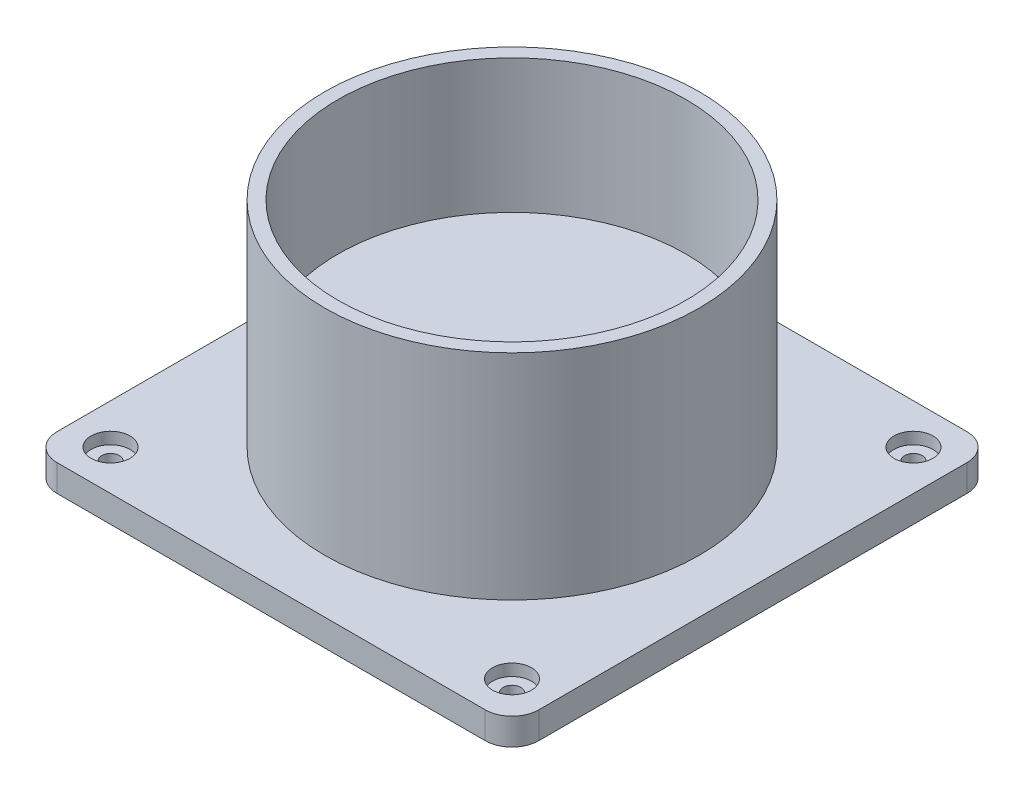
ISO-10303-21;
HEADER;
FILE_DESCRIPTION(('STEP AP214'),'2;1');
FILE_NAME('part.step','',(''),(''),'','','');
FILE_SCHEMA(('AUTOMOTIVE_DESIGN { 1 0 10303 214 1 1 1 1 }'));
ENDSEC;
DATA;
#1=APPLICATION_CONTEXT('core data for automotive mechanical design processes');
#2=APPLICATION_PROTOCOL_DEFINITION('international standard','automotive_design',2000,#1);
#3=PRODUCT_CONTEXT('',#1,'mechanical');
#4=PRODUCT('Part','Part','',(#3));
#5=PRODUCT_RELATED_PRODUCT_CATEGORY('part','',(#4));
#6=PRODUCT_DEFINITION_FORMATION('','',#4);
#7=PRODUCT_DEFINITION_CONTEXT('part definition',#1,'design');
#8=PRODUCT_DEFINITION('design','',#6,#7);
#9=PRODUCT_DEFINITION_SHAPE('','',#8);
#10=(LENGTH_UNIT() NAMED_UNIT(*) SI_UNIT(.MILLI.,.METRE.));
#11=(NAMED_UNIT(*) PLANE_ANGLE_UNIT() SI_UNIT($,.RADIAN.));
#12=(NAMED_UNIT(*) SI_UNIT($,.STERADIAN.) SOLID_ANGLE_UNIT());
#13=UNCERTAINTY_MEASURE_WITH_UNIT(LENGTH_MEASURE(1.E-05),#10,'distance_accuracy_value','');
#14=(GEOMETRIC_REPRESENTATION_CONTEXT(3) GLOBAL_UNCERTAINTY_ASSIGNED_CONTEXT((#13)) GLOBAL_UNIT_ASSIGNED_CONTEXT((#10,
#11,#12)) REPRESENTATION_CONTEXT('',''));
#15=CARTESIAN_POINT('',(0.,0.,0.));
#16=DIRECTION('',(0.,0.,1.));
#17=DIRECTION('',(1.,0.,0.));
#18=AXIS2_PLACEMENT_3D('',#15,#16,#17);
#19=CARTESIAN_POINT('',(0.,0.,0.));
#20=DIRECTION('',(0.,-1.,0.));
#21=DIRECTION('',(0.,0.,-1.));
#22=AXIS2_PLACEMENT_3D('',#19,#20,#21);
#23=PLANE('',#22);
#24=DIRECTION('',(0.,0.,-1.));
#25=VECTOR('',#24,1.);
#26=CARTESIAN_POINT('',(90.,0.,90.));
#27=LINE('',#26,#25);
#28=CARTESIAN_POINT('',(90.,0.,80.));
#29=VERTEX_POINT('',#28);
#30=CARTESIAN_POINT('',(90.,0.,-79.9999999999999));
#31=VERTEX_POINT('',#30);
#32=EDGE_CURVE('E120',#29,#31,#27,.T.);
#33=ORIENTED_EDGE('',*,*,#32,.F.);
#34=CARTESIAN_POINT('',(80.,0.,80.));
#35=DIRECTION('',(0.,-1.,0.));
#36=DIRECTION('',(0.,0.,-1.));
#37=AXIS2_PLACEMENT_3D('',#34,#35,#36);
#38=CIRCLE('',#37,10.);
#39=CARTESIAN_POINT('',(79.9999999999999,0.,90.));
#40=VERTEX_POINT('',#39);
#41=EDGE_CURVE('E103',#29,#40,#38,.T.);
#42=ORIENTED_EDGE('',*,*,#41,.T.);
#43=DIRECTION('',(1.,0.,0.));
#44=VECTOR('',#43,1.);
#45=CARTESIAN_POINT('',(-90.,0.,90.));
#46=LINE('',#45,#44);
#47=CARTESIAN_POINT('',(-80.,0.,90.));
#48=VERTEX_POINT('',#47);
#49=EDGE_CURVE('E144',#48,#40,#46,.T.);
#50=ORIENTED_EDGE('',*,*,#49,.F.);
#51=CARTESIAN_POINT('',(-80.,0.,80.));
#52=DIRECTION('',(0.,-1.,0.));
#53=DIRECTION('',(0.,0.,-1.));
#54=AXIS2_PLACEMENT_3D('',#51,#52,#53);
#55=CIRCLE('',#54,10.);
#56=CARTESIAN_POINT('',(-90.,0.,80.));
#57=VERTEX_POINT('',#56);
#58=EDGE_CURVE('E124',#48,#57,#55,.T.);
#59=ORIENTED_EDGE('',*,*,#58,.T.);
#60=DIRECTION('',(0.,0.,1.));
#61=VECTOR('',#60,1.);
#62=CARTESIAN_POINT('',(-90.,0.,90.));
#63=LINE('',#62,#61);
#64=CARTESIAN_POINT('',(-90.,0.,-79.9999999999999));
#65=VERTEX_POINT('',#64);
#66=EDGE_CURVE('E134',#65,#57,#63,.T.);
#67=ORIENTED_EDGE('',*,*,#66,.F.);
#68=CARTESIAN_POINT('',(-80.,0.,-80.));
#69=DIRECTION('',(0.,-1.,0.));
#70=DIRECTION('',(0.,0.,-1.));
#71=AXIS2_PLACEMENT_3D('',#68,#69,#70);
#72=CIRCLE('',#71,10.);
#73=CARTESIAN_POINT('',(-80.,0.,-90.));
#74=VERTEX_POINT('',#73);
#75=EDGE_CURVE('E114',#65,#74,#72,.T.);
#76=ORIENTED_EDGE('',*,*,#75,.T.);
#77=DIRECTION('',(-1.,0.,0.));
#78=VECTOR('',#77,1.);
#79=CARTESIAN_POINT('',(-90.,0.,-90.));
#80=LINE('',#79,#78);
#81=CARTESIAN_POINT('',(79.9999999999999,0.,-90.));
#82=VERTEX_POINT('',#81);
#83=EDGE_CURVE('E130',#82,#74,#80,.T.);
#84=ORIENTED_EDGE('',*,*,#83,.F.);
#85=CARTESIAN_POINT('',(80.,0.,-80.));
#86=DIRECTION('',(0.,-1.,0.));
#87=DIRECTION('',(0.,0.,-1.));
#88=AXIS2_PLACEMENT_3D('',#85,#86,#87);
#89=CIRCLE('',#88,10.);
#90=EDGE_CURVE('E129',#82,#31,#89,.T.);
#91=ORIENTED_EDGE('',*,*,#90,.T.);
#92=EDGE_LOOP('',(#33,#42,#50,#59,#67,#76,#84,#91));
#93=FACE_BOUND('',#92,.T.);
#94=CARTESIAN_POINT('',(-75.,0.,75.));
#95=DIRECTION('',(0.,1.,0.));
#96=DIRECTION('',(0.,0.,1.));
#97=AXIS2_PLACEMENT_3D('',#94,#95,#96);
#98=CIRCLE('',#97,3.3);
#99=CARTESIAN_POINT('',(-75.,0.,78.3));
#100=VERTEX_POINT('',#99);
#101=EDGE_CURVE('E189',#100,#100,#98,.T.);
#102=ORIENTED_EDGE('',*,*,#101,.T.);
#103=EDGE_LOOP('',(#102));
#104=FACE_BOUND('',#103,.T.);
#105=CARTESIAN_POINT('',(75.,0.,75.));
#106=DIRECTION('',(0.,1.,0.));
#107=DIRECTION('',(0.,0.,1.));
#108=AXIS2_PLACEMENT_3D('',#105,#106,#107);
#109=CIRCLE('',#108,3.3);
#110=CARTESIAN_POINT('',(75.,0.,78.3));
#111=VERTEX_POINT('',#110);
#112=EDGE_CURVE('E203',#111,#111,#109,.T.);
#113=ORIENTED_EDGE('',*,*,#112,.T.);
#114=EDGE_LOOP('',(#113));
#115=FACE_BOUND('',#114,.T.);
#116=CARTESIAN_POINT('',(75.,0.,-75.));
#117=DIRECTION('',(0.,1.,0.));
#118=DIRECTION('',(0.,0.,1.));
#119=AXIS2_PLACEMENT_3D('',#116,#117,#118);
#120=CIRCLE('',#119,3.3);
#121=CARTESIAN_POINT('',(75.,0.,-71.7));
#122=VERTEX_POINT('',#121);
#123=EDGE_CURVE('E215',#122,#122,#120,.T.);
#124=ORIENTED_EDGE('',*,*,#123,.T.);
#125=EDGE_LOOP('',(#124));
#126=FACE_BOUND('',#125,.T.);
#127=CARTESIAN_POINT('',(-75.,0.,-75.));
#128=DIRECTION('',(0.,1.,0.));
#129=DIRECTION('',(0.,0.,1.));
#130=AXIS2_PLACEMENT_3D('',#127,#128,#129);
#131=CIRCLE('',#130,3.3);
#132=CARTESIAN_POINT('',(-75.,0.,-71.7));
#133=VERTEX_POINT('',#132);
#134=EDGE_CURVE('E227',#133,#133,#131,.T.);
#135=ORIENTED_EDGE('',*,*,#134,.T.);
#136=EDGE_LOOP('',(#135));
#137=FACE_BOUND('',#136,.T.);
#138=ADVANCED_FACE('F37',(#93,#104,#115,#126,#137),#23,.T.);
#139=CARTESIAN_POINT('',(90.,10.,90.));
#140=DIRECTION('',(-1.,0.,0.));
#141=DIRECTION('',(0.,0.,1.));
#142=AXIS2_PLACEMENT_3D('',#139,#140,#141);
#143=PLANE('',#142);
#144=DIRECTION('',(0.,0.,-1.));
#145=VECTOR('',#144,1.);
#146=CARTESIAN_POINT('',(90.,10.,90.));
#147=LINE('',#146,#145);
#148=CARTESIAN_POINT('',(90.,10.,80.));
#149=VERTEX_POINT('',#148);
#150=CARTESIAN_POINT('',(90.,10.,-79.9999999999999));
#151=VERTEX_POINT('',#150);
#152=EDGE_CURVE('E123',#149,#151,#147,.T.);
#153=ORIENTED_EDGE('',*,*,#152,.F.);
#154=DIRECTION('',(0.,-1.,0.));
#155=VECTOR('',#154,1.);
#156=CARTESIAN_POINT('',(90.,10.,80.));
#157=LINE('',#156,#155);
#158=EDGE_CURVE('E107',#149,#29,#157,.T.);
#159=ORIENTED_EDGE('',*,*,#158,.T.);
#160=ORIENTED_EDGE('',*,*,#32,.T.);
#161=DIRECTION('',(0.,-1.,0.));
#162=VECTOR('',#161,1.);
#163=CARTESIAN_POINT('',(90.,10.,-80.));
#164=LINE('',#163,#162);
#165=EDGE_CURVE('E125',#31,#151,#164,.F.);
#166=ORIENTED_EDGE('',*,*,#165,.T.);
#167=EDGE_LOOP('',(#153,#159,#160,#166));
#168=FACE_BOUND('',#167,.T.);
#169=ADVANCED_FACE('F119',(#168),#143,.F.);
#170=CARTESIAN_POINT('',(-90.,10.,-90.));
#171=DIRECTION('',(0.,0.,1.));
#172=DIRECTION('',(1.,0.,0.));
#173=AXIS2_PLACEMENT_3D('',#170,#171,#172);
#174=PLANE('',#173);
#175=ORIENTED_EDGE('',*,*,#83,.T.);
#176=DIRECTION('',(0.,-1.,0.));
#177=VECTOR('',#176,1.);
#178=CARTESIAN_POINT('',(-80.,10.,-90.));
#179=LINE('',#178,#177);
#180=CARTESIAN_POINT('',(-80.,10.,-90.));
#181=VERTEX_POINT('',#180);
#182=EDGE_CURVE('E11',#74,#181,#179,.F.);
#183=ORIENTED_EDGE('',*,*,#182,.T.);
#184=DIRECTION('',(-1.,0.,0.));
#185=VECTOR('',#184,1.);
#186=CARTESIAN_POINT('',(-90.,10.,-90.));
#187=LINE('',#186,#185);
#188=CARTESIAN_POINT('',(79.9999999999999,10.,-90.));
#189=VERTEX_POINT('',#188);
#190=EDGE_CURVE('E170',#189,#181,#187,.T.);
#191=ORIENTED_EDGE('',*,*,#190,.F.);
#192=DIRECTION('',(0.,-1.,0.));
#193=VECTOR('',#192,1.);
#194=CARTESIAN_POINT('',(80.,10.,-90.));
#195=LINE('',#194,#193);
#196=EDGE_CURVE('E45',#189,#82,#195,.T.);
#197=ORIENTED_EDGE('',*,*,#196,.T.);
#198=EDGE_LOOP('',(#175,#183,#191,#197));
#199=FACE_BOUND('',#198,.T.);
#200=ADVANCED_FACE('F168',(#199),#174,.F.);
#201=CARTESIAN_POINT('',(-90.,10.,90.));
#202=DIRECTION('',(1.,0.,0.));
#203=DIRECTION('',(0.,0.,-1.));
#204=AXIS2_PLACEMENT_3D('',#201,#202,#203);
#205=PLANE('',#204);
#206=DIRECTION('',(0.,0.,1.));
#207=VECTOR('',#206,1.);
#208=CARTESIAN_POINT('',(-90.,10.,90.));
#209=LINE('',#208,#207);
#210=CARTESIAN_POINT('',(-90.,10.,-79.9999999999999));
#211=VERTEX_POINT('',#210);
#212=CARTESIAN_POINT('',(-90.,10.,80.));
#213=VERTEX_POINT('',#212);
#214=EDGE_CURVE('E178',#211,#213,#209,.T.);
#215=ORIENTED_EDGE('',*,*,#214,.F.);
#216=DIRECTION('',(0.,-1.,0.));
#217=VECTOR('',#216,1.);
#218=CARTESIAN_POINT('',(-90.,10.,-80.));
#219=LINE('',#218,#217);
#220=EDGE_CURVE('E162',#211,#65,#219,.T.);
#221=ORIENTED_EDGE('',*,*,#220,.T.);
#222=ORIENTED_EDGE('',*,*,#66,.T.);
#223=DIRECTION('',(0.,-1.,0.));
#224=VECTOR('',#223,1.);
#225=CARTESIAN_POINT('',(-90.,10.,80.));
#226=LINE('',#225,#224);
#227=EDGE_CURVE('E52',#57,#213,#226,.F.);
#228=ORIENTED_EDGE('',*,*,#227,.T.);
#229=EDGE_LOOP('',(#215,#221,#222,#228));
#230=FACE_BOUND('',#229,.T.);
#231=ADVANCED_FACE('F177',(#230),#205,.F.);
#232=CARTESIAN_POINT('',(-90.,10.,90.));
#233=DIRECTION('',(0.,0.,-1.));
#234=DIRECTION('',(-1.,0.,0.));
#235=AXIS2_PLACEMENT_3D('',#232,#233,#234);
#236=PLANE('',#235);
#237=ORIENTED_EDGE('',*,*,#49,.T.);
#238=DIRECTION('',(0.,-1.,0.));
#239=VECTOR('',#238,1.);
#240=CARTESIAN_POINT('',(80.,10.,90.));
#241=LINE('',#240,#239);
#242=CARTESIAN_POINT('',(79.9999999999999,10.,90.));
#243=VERTEX_POINT('',#242);
#244=EDGE_CURVE('E108',#40,#243,#241,.F.);
#245=ORIENTED_EDGE('',*,*,#244,.T.);
#246=DIRECTION('',(1.,0.,0.));
#247=VECTOR('',#246,1.);
#248=CARTESIAN_POINT('',(-90.,10.,90.));
#249=LINE('',#248,#247);
#250=CARTESIAN_POINT('',(-80.,10.,90.));
#251=VERTEX_POINT('',#250);
#252=EDGE_CURVE('E140',#251,#243,#249,.T.);
#253=ORIENTED_EDGE('',*,*,#252,.F.);
#254=DIRECTION('',(0.,-1.,0.));
#255=VECTOR('',#254,1.);
#256=CARTESIAN_POINT('',(-80.,10.,90.));
#257=LINE('',#256,#255);
#258=EDGE_CURVE('E113',#251,#48,#257,.T.);
#259=ORIENTED_EDGE('',*,*,#258,.T.);
#260=EDGE_LOOP('',(#237,#245,#253,#259));
#261=FACE_BOUND('',#260,.T.);
#262=ADVANCED_FACE('F246',(#261),#236,.F.);
#263=CARTESIAN_POINT('',(0.,10.,0.));
#264=DIRECTION('',(0.,-1.,0.));
#265=DIRECTION('',(0.,0.,-1.));
#266=AXIS2_PLACEMENT_3D('',#263,#264,#265);
#267=PLANE('',#266);
#268=CARTESIAN_POINT('',(-75.,10.,-75.));
#269=DIRECTION('',(0.,1.,0.));
#270=DIRECTION('',(0.,0.,1.));
#271=AXIS2_PLACEMENT_3D('',#268,#269,#270);
#272=CIRCLE('',#271,7.27499999999999);
#273=CARTESIAN_POINT('',(-75.,10.,-67.725));
#274=VERTEX_POINT('',#273);
#275=EDGE_CURVE('E236',#274,#274,#272,.T.);
#276=ORIENTED_EDGE('',*,*,#275,.F.);
#277=EDGE_LOOP('',(#276));
#278=FACE_BOUND('',#277,.T.);
#279=CARTESIAN_POINT('',(75.,10.,-75.));
#280=DIRECTION('',(0.,1.,0.));
#281=DIRECTION('',(0.,0.,1.));
#282=AXIS2_PLACEMENT_3D('',#279,#280,#281);
#283=CIRCLE('',#282,7.27499999999999);
#284=CARTESIAN_POINT('',(75.,10.,-67.725));
#285=VERTEX_POINT('',#284);
#286=EDGE_CURVE('E224',#285,#285,#283,.T.);
#287=ORIENTED_EDGE('',*,*,#286,.F.);
#288=EDGE_LOOP('',(#287));
#289=FACE_BOUND('',#288,.T.);
#290=CARTESIAN_POINT('',(75.,10.,75.));
#291=DIRECTION('',(0.,1.,0.));
#292=DIRECTION('',(0.,0.,1.));
#293=AXIS2_PLACEMENT_3D('',#290,#291,#292);
#294=CIRCLE('',#293,7.27499999999999);
#295=CARTESIAN_POINT('',(75.,10.,82.275));
#296=VERTEX_POINT('',#295);
#297=EDGE_CURVE('E212',#296,#296,#294,.T.);
#298=ORIENTED_EDGE('',*,*,#297,.F.);
#299=EDGE_LOOP('',(#298));
#300=FACE_BOUND('',#299,.T.);
#301=CARTESIAN_POINT('',(-75.,10.,75.));
#302=DIRECTION('',(0.,1.,0.));
#303=DIRECTION('',(0.,0.,1.));
#304=AXIS2_PLACEMENT_3D('',#301,#302,#303);
#305=CIRCLE('',#304,7.27499999999999);
#306=CARTESIAN_POINT('',(-75.,10.,82.275));
#307=VERTEX_POINT('',#306);
#308=EDGE_CURVE('E200',#307,#307,#305,.T.);
#309=ORIENTED_EDGE('',*,*,#308,.F.);
#310=EDGE_LOOP('',(#309));
#311=FACE_BOUND('',#310,.T.);
#312=CARTESIAN_POINT('',(0.,10.,0.));
#313=DIRECTION('',(0.,1.,0.));
#314=DIRECTION('',(0.,0.,1.));
#315=AXIS2_PLACEMENT_3D('',#312,#313,#314);
#316=CIRCLE('',#315,70.);
#317=CARTESIAN_POINT('',(0.,10.,70.));
#318=VERTEX_POINT('',#317);
#319=EDGE_CURVE('E146',#318,#318,#316,.T.);
#320=ORIENTED_EDGE('',*,*,#319,.F.);
#321=EDGE_LOOP('',(#320));
#322=FACE_BOUND('',#321,.T.);
#323=ORIENTED_EDGE('',*,*,#252,.T.);
#324=CARTESIAN_POINT('',(80.,10.,80.));
#325=DIRECTION('',(0.,-1.,0.));
#326=DIRECTION('',(0.,0.,-1.));
#327=AXIS2_PLACEMENT_3D('',#324,#325,#326);
#328=CIRCLE('',#327,10.);
#329=EDGE_CURVE('E159',#243,#149,#328,.F.);
#330=ORIENTED_EDGE('',*,*,#329,.T.);
#331=ORIENTED_EDGE('',*,*,#152,.T.);
#332=CARTESIAN_POINT('',(80.,10.,-80.));
#333=DIRECTION('',(0.,-1.,0.));
#334=DIRECTION('',(0.,0.,-1.));
#335=AXIS2_PLACEMENT_3D('',#332,#333,#334);
#336=CIRCLE('',#335,10.);
#337=EDGE_CURVE('E156',#151,#189,#336,.F.);
#338=ORIENTED_EDGE('',*,*,#337,.T.);
#339=ORIENTED_EDGE('',*,*,#190,.T.);
#340=CARTESIAN_POINT('',(-80.,10.,-80.));
#341=DIRECTION('',(0.,-1.,0.));
#342=DIRECTION('',(0.,0.,-1.));
#343=AXIS2_PLACEMENT_3D('',#340,#341,#342);
#344=CIRCLE('',#343,10.);
#345=EDGE_CURVE('E59',#181,#211,#344,.F.);
#346=ORIENTED_EDGE('',*,*,#345,.T.);
#347=ORIENTED_EDGE('',*,*,#214,.T.);
#348=CARTESIAN_POINT('',(-80.,10.,80.));
#349=DIRECTION('',(0.,-1.,0.));
#350=DIRECTION('',(0.,0.,-1.));
#351=AXIS2_PLACEMENT_3D('',#348,#349,#350);
#352=CIRCLE('',#351,10.);
#353=EDGE_CURVE('E154',#213,#251,#352,.F.);
#354=ORIENTED_EDGE('',*,*,#353,.T.);
#355=EDGE_LOOP('',(#323,#330,#331,#338,#339,#346,#347,#354));
#356=FACE_BOUND('',#355,.T.);
#357=ADVANCED_FACE('F242',(#278,#289,#300,#311,#322,#356),#267,.F.);
#358=CARTESIAN_POINT('',(0.,90.,0.));
#359=DIRECTION('',(0.,-1.,0.));
#360=DIRECTION('',(0.,0.,-1.));
#361=AXIS2_PLACEMENT_3D('',#358,#359,#360);
#362=CYLINDRICAL_SURFACE('',#361,70.);
#363=CARTESIAN_POINT('',(0.,90.,0.));
#364=DIRECTION('',(0.,1.,0.));
#365=DIRECTION('',(0.,0.,1.));
#366=AXIS2_PLACEMENT_3D('',#363,#364,#365);
#367=CIRCLE('',#366,70.);
#368=CARTESIAN_POINT('',(0.,90.,70.));
#369=VERTEX_POINT('',#368);
#370=EDGE_CURVE('E131',#369,#369,#367,.T.);
#371=ORIENTED_EDGE('',*,*,#370,.F.);
#372=EDGE_LOOP('',(#371));
#373=FACE_BOUND('',#372,.T.);
#374=ORIENTED_EDGE('',*,*,#319,.T.);
#375=EDGE_LOOP('',(#374));
#376=FACE_BOUND('',#375,.T.);
#377=ADVANCED_FACE('F245',(#373,#376),#362,.T.);
#378=CARTESIAN_POINT('',(0.,90.,0.));
#379=DIRECTION('',(0.,1.,0.));
#380=DIRECTION('',(0.,0.,1.));
#381=AXIS2_PLACEMENT_3D('',#378,#379,#380);
#382=PLANE('',#381);
#383=CARTESIAN_POINT('',(0.,90.,0.));
#384=DIRECTION('',(0.,1.,0.));
#385=DIRECTION('',(0.,0.,1.));
#386=AXIS2_PLACEMENT_3D('',#383,#384,#385);
#387=CIRCLE('',#386,65.);
#388=CARTESIAN_POINT('',(0.,90.,65.));
#389=VERTEX_POINT('',#388);
#390=EDGE_CURVE('E186',#389,#389,#387,.T.);
#391=ORIENTED_EDGE('',*,*,#390,.F.);
#392=EDGE_LOOP('',(#391));
#393=FACE_BOUND('',#392,.T.);
#394=ORIENTED_EDGE('',*,*,#370,.T.);
#395=EDGE_LOOP('',(#394));
#396=FACE_BOUND('',#395,.T.);
#397=ADVANCED_FACE('F446',(#393,#396),#382,.T.);
#398=CARTESIAN_POINT('',(0.,40.,0.));
#399=DIRECTION('',(0.,1.,0.));
#400=DIRECTION('',(0.,0.,1.));
#401=AXIS2_PLACEMENT_3D('',#398,#399,#400);
#402=CYLINDRICAL_SURFACE('',#401,65.);
#403=CARTESIAN_POINT('',(0.,40.,0.));
#404=DIRECTION('',(0.,1.,0.));
#405=DIRECTION('',(0.,0.,1.));
#406=AXIS2_PLACEMENT_3D('',#403,#404,#405);
#407=CIRCLE('',#406,65.);
#408=CARTESIAN_POINT('',(0.,40.,65.));
#409=VERTEX_POINT('',#408);
#410=EDGE_CURVE('E137',#409,#409,#407,.T.);
#411=ORIENTED_EDGE('',*,*,#410,.F.);
#412=EDGE_LOOP('',(#411));
#413=FACE_BOUND('',#412,.T.);
#414=ORIENTED_EDGE('',*,*,#390,.T.);
#415=EDGE_LOOP('',(#414));
#416=FACE_BOUND('',#415,.T.);
#417=ADVANCED_FACE('F436',(#413,#416),#402,.F.);
#418=CARTESIAN_POINT('',(0.,40.,0.));
#419=DIRECTION('',(0.,1.,0.));
#420=DIRECTION('',(0.,0.,1.));
#421=AXIS2_PLACEMENT_3D('',#418,#419,#420);
#422=PLANE('',#421);
#423=ORIENTED_EDGE('',*,*,#410,.T.);
#424=EDGE_LOOP('',(#423));
#425=FACE_BOUND('',#424,.T.);
#426=ADVANCED_FACE('F425',(#425),#422,.T.);
#427=CARTESIAN_POINT('',(-75.,10.,75.));
#428=DIRECTION('',(0.,1.,0.));
#429=DIRECTION('',(0.,0.,1.));
#430=AXIS2_PLACEMENT_3D('',#427,#428,#429);
#431=CYLINDRICAL_SURFACE('',#430,3.3);
#432=ORIENTED_EDGE('',*,*,#101,.F.);
#433=EDGE_LOOP('',(#432));
#434=FACE_BOUND('',#433,.T.);
#435=CARTESIAN_POINT('',(-75.,5.62,75.));
#436=DIRECTION('',(0.,1.,0.));
#437=DIRECTION('',(0.,0.,1.));
#438=AXIS2_PLACEMENT_3D('',#435,#436,#437);
#439=CIRCLE('',#438,3.30000000000001);
#440=CARTESIAN_POINT('',(-75.,5.62,78.3));
#441=VERTEX_POINT('',#440);
#442=EDGE_CURVE('E194',#441,#441,#439,.T.);
#443=ORIENTED_EDGE('',*,*,#442,.T.);
#444=EDGE_LOOP('',(#443));
#445=FACE_BOUND('',#444,.T.);
#446=ADVANCED_FACE('F415',(#434,#445),#431,.F.);
#447=CARTESIAN_POINT('',(-71.7,5.62,75.));
#448=DIRECTION('',(0.,-1.,0.));
#449=DIRECTION('',(0.,0.,-1.));
#450=AXIS2_PLACEMENT_3D('',#447,#448,#449);
#451=PLANE('',#450);
#452=ORIENTED_EDGE('',*,*,#442,.F.);
#453=EDGE_LOOP('',(#452));
#454=FACE_BOUND('',#453,.T.);
#455=CARTESIAN_POINT('',(-75.,5.62,75.));
#456=DIRECTION('',(0.,1.,0.));
#457=DIRECTION('',(0.,0.,1.));
#458=AXIS2_PLACEMENT_3D('',#455,#456,#457);
#459=CIRCLE('',#458,7.27499999999999);
#460=CARTESIAN_POINT('',(-75.,5.62,82.275));
#461=VERTEX_POINT('',#460);
#462=EDGE_CURVE('E197',#461,#461,#459,.T.);
#463=ORIENTED_EDGE('',*,*,#462,.T.);
#464=EDGE_LOOP('',(#463));
#465=FACE_BOUND('',#464,.T.);
#466=ADVANCED_FACE('F405',(#454,#465),#451,.F.);
#467=CARTESIAN_POINT('',(-75.,10.,75.));
#468=DIRECTION('',(0.,1.,0.));
#469=DIRECTION('',(0.,0.,1.));
#470=AXIS2_PLACEMENT_3D('',#467,#468,#469);
#471=CYLINDRICAL_SURFACE('',#470,7.27499999999999);
#472=ORIENTED_EDGE('',*,*,#462,.F.);
#473=EDGE_LOOP('',(#472));
#474=FACE_BOUND('',#473,.T.);
#475=ORIENTED_EDGE('',*,*,#308,.T.);
#476=EDGE_LOOP('',(#475));
#477=FACE_BOUND('',#476,.T.);
#478=ADVANCED_FACE('F395',(#474,#477),#471,.F.);
#479=CARTESIAN_POINT('',(75.,10.,75.));
#480=DIRECTION('',(0.,1.,0.));
#481=DIRECTION('',(0.,0.,1.));
#482=AXIS2_PLACEMENT_3D('',#479,#480,#481);
#483=CYLINDRICAL_SURFACE('',#482,3.3);
#484=ORIENTED_EDGE('',*,*,#112,.F.);
#485=EDGE_LOOP('',(#484));
#486=FACE_BOUND('',#485,.T.);
#487=CARTESIAN_POINT('',(75.,5.62,75.));
#488=DIRECTION('',(0.,1.,0.));
#489=DIRECTION('',(0.,0.,1.));
#490=AXIS2_PLACEMENT_3D('',#487,#488,#489);
#491=CIRCLE('',#490,3.30000000000001);
#492=CARTESIAN_POINT('',(75.,5.62,78.3));
#493=VERTEX_POINT('',#492);
#494=EDGE_CURVE('E206',#493,#493,#491,.T.);
#495=ORIENTED_EDGE('',*,*,#494,.T.);
#496=EDGE_LOOP('',(#495));
#497=FACE_BOUND('',#496,.T.);
#498=ADVANCED_FACE('F385',(#486,#497),#483,.F.);
#499=CARTESIAN_POINT('',(78.3,5.62,75.));
#500=DIRECTION('',(0.,-1.,0.));
#501=DIRECTION('',(0.,0.,-1.));
#502=AXIS2_PLACEMENT_3D('',#499,#500,#501);
#503=PLANE('',#502);
#504=ORIENTED_EDGE('',*,*,#494,.F.);
#505=EDGE_LOOP('',(#504));
#506=FACE_BOUND('',#505,.T.);
#507=CARTESIAN_POINT('',(75.,5.62,75.));
#508=DIRECTION('',(0.,1.,0.));
#509=DIRECTION('',(0.,0.,1.));
#510=AXIS2_PLACEMENT_3D('',#507,#508,#509);
#511=CIRCLE('',#510,7.27499999999999);
#512=CARTESIAN_POINT('',(75.,5.62,82.275));
#513=VERTEX_POINT('',#512);
#514=EDGE_CURVE('E209',#513,#513,#511,.T.);
#515=ORIENTED_EDGE('',*,*,#514,.T.);
#516=EDGE_LOOP('',(#515));
#517=FACE_BOUND('',#516,.T.);
#518=ADVANCED_FACE('F375',(#506,#517),#503,.F.);
#519=CARTESIAN_POINT('',(75.,10.,75.));
#520=DIRECTION('',(0.,1.,0.));
#521=DIRECTION('',(0.,0.,1.));
#522=AXIS2_PLACEMENT_3D('',#519,#520,#521);
#523=CYLINDRICAL_SURFACE('',#522,7.27499999999999);
#524=ORIENTED_EDGE('',*,*,#514,.F.);
#525=EDGE_LOOP('',(#524));
#526=FACE_BOUND('',#525,.T.);
#527=ORIENTED_EDGE('',*,*,#297,.T.);
#528=EDGE_LOOP('',(#527));
#529=FACE_BOUND('',#528,.T.);
#530=ADVANCED_FACE('F365',(#526,#529),#523,.F.);
#531=CARTESIAN_POINT('',(75.,10.,-75.));
#532=DIRECTION('',(0.,1.,0.));
#533=DIRECTION('',(0.,0.,1.));
#534=AXIS2_PLACEMENT_3D('',#531,#532,#533);
#535=CYLINDRICAL_SURFACE('',#534,3.3);
#536=ORIENTED_EDGE('',*,*,#123,.F.);
#537=EDGE_LOOP('',(#536));
#538=FACE_BOUND('',#537,.T.);
#539=CARTESIAN_POINT('',(75.,5.62,-75.));
#540=DIRECTION('',(0.,1.,0.));
#541=DIRECTION('',(0.,0.,1.));
#542=AXIS2_PLACEMENT_3D('',#539,#540,#541);
#543=CIRCLE('',#542,3.30000000000001);
#544=CARTESIAN_POINT('',(75.,5.62,-71.7));
#545=VERTEX_POINT('',#544);
#546=EDGE_CURVE('E218',#545,#545,#543,.T.);
#547=ORIENTED_EDGE('',*,*,#546,.T.);
#548=EDGE_LOOP('',(#547));
#549=FACE_BOUND('',#548,.T.);
#550=ADVANCED_FACE('F355',(#538,#549),#535,.F.);
#551=CARTESIAN_POINT('',(78.3,5.62,-75.));
#552=DIRECTION('',(0.,-1.,0.));
#553=DIRECTION('',(0.,0.,-1.));
#554=AXIS2_PLACEMENT_3D('',#551,#552,#553);
#555=PLANE('',#554);
#556=ORIENTED_EDGE('',*,*,#546,.F.);
#557=EDGE_LOOP('',(#556));
#558=FACE_BOUND('',#557,.T.);
#559=CARTESIAN_POINT('',(75.,5.62,-75.));
#560=DIRECTION('',(0.,1.,0.));
#561=DIRECTION('',(0.,0.,1.));
#562=AXIS2_PLACEMENT_3D('',#559,#560,#561);
#563=CIRCLE('',#562,7.27499999999999);
#564=CARTESIAN_POINT('',(75.,5.62,-67.725));
#565=VERTEX_POINT('',#564);
#566=EDGE_CURVE('E221',#565,#565,#563,.T.);
#567=ORIENTED_EDGE('',*,*,#566,.T.);
#568=EDGE_LOOP('',(#567));
#569=FACE_BOUND('',#568,.T.);
#570=ADVANCED_FACE('F345',(#558,#569),#555,.F.);
#571=CARTESIAN_POINT('',(75.,10.,-75.));
#572=DIRECTION('',(0.,1.,0.));
#573=DIRECTION('',(0.,0.,1.));
#574=AXIS2_PLACEMENT_3D('',#571,#572,#573);
#575=CYLINDRICAL_SURFACE('',#574,7.27499999999999);
#576=ORIENTED_EDGE('',*,*,#566,.F.);
#577=EDGE_LOOP('',(#576));
#578=FACE_BOUND('',#577,.T.);
#579=ORIENTED_EDGE('',*,*,#286,.T.);
#580=EDGE_LOOP('',(#579));
#581=FACE_BOUND('',#580,.T.);
#582=ADVANCED_FACE('F335',(#578,#581),#575,.F.);
#583=CARTESIAN_POINT('',(-75.,10.,-75.));
#584=DIRECTION('',(0.,1.,0.));
#585=DIRECTION('',(0.,0.,1.));
#586=AXIS2_PLACEMENT_3D('',#583,#584,#585);
#587=CYLINDRICAL_SURFACE('',#586,3.3);
#588=ORIENTED_EDGE('',*,*,#134,.F.);
#589=EDGE_LOOP('',(#588));
#590=FACE_BOUND('',#589,.T.);
#591=CARTESIAN_POINT('',(-75.,5.62,-75.));
#592=DIRECTION('',(0.,1.,0.));
#593=DIRECTION('',(0.,0.,1.));
#594=AXIS2_PLACEMENT_3D('',#591,#592,#593);
#595=CIRCLE('',#594,3.30000000000001);
#596=CARTESIAN_POINT('',(-75.,5.62,-71.7));
#597=VERTEX_POINT('',#596);
#598=EDGE_CURVE('E230',#597,#597,#595,.T.);
#599=ORIENTED_EDGE('',*,*,#598,.T.);
#600=EDGE_LOOP('',(#599));
#601=FACE_BOUND('',#600,.T.);
#602=ADVANCED_FACE('F325',(#590,#601),#587,.F.);
#603=CARTESIAN_POINT('',(-71.7,5.62,-75.));
#604=DIRECTION('',(0.,-1.,0.));
#605=DIRECTION('',(0.,0.,-1.));
#606=AXIS2_PLACEMENT_3D('',#603,#604,#605);
#607=PLANE('',#606);
#608=ORIENTED_EDGE('',*,*,#598,.F.);
#609=EDGE_LOOP('',(#608));
#610=FACE_BOUND('',#609,.T.);
#611=CARTESIAN_POINT('',(-75.,5.62,-75.));
#612=DIRECTION('',(0.,1.,0.));
#613=DIRECTION('',(0.,0.,1.));
#614=AXIS2_PLACEMENT_3D('',#611,#612,#613);
#615=CIRCLE('',#614,7.27499999999999);
#616=CARTESIAN_POINT('',(-75.,5.62,-67.725));
#617=VERTEX_POINT('',#616);
#618=EDGE_CURVE('E233',#617,#617,#615,.T.);
#619=ORIENTED_EDGE('',*,*,#618,.T.);
#620=EDGE_LOOP('',(#619));
#621=FACE_BOUND('',#620,.T.);
#622=ADVANCED_FACE('F315',(#610,#621),#607,.F.);
#623=CARTESIAN_POINT('',(-75.,10.,-75.));
#624=DIRECTION('',(0.,1.,0.));
#625=DIRECTION('',(0.,0.,1.));
#626=AXIS2_PLACEMENT_3D('',#623,#624,#625);
#627=CYLINDRICAL_SURFACE('',#626,7.27499999999999);
#628=ORIENTED_EDGE('',*,*,#618,.F.);
#629=EDGE_LOOP('',(#628));
#630=FACE_BOUND('',#629,.T.);
#631=ORIENTED_EDGE('',*,*,#275,.T.);
#632=EDGE_LOOP('',(#631));
#633=FACE_BOUND('',#632,.T.);
#634=ADVANCED_FACE('F240',(#630,#633),#627,.F.);
#635=CARTESIAN_POINT('',(80.,10.,80.));
#636=DIRECTION('',(0.,-1.,0.));
#637=DIRECTION('',(0.,0.,-1.));
#638=AXIS2_PLACEMENT_3D('',#635,#636,#637);
#639=CYLINDRICAL_SURFACE('',#638,10.);
#640=ORIENTED_EDGE('',*,*,#329,.F.);
#641=ORIENTED_EDGE('',*,*,#244,.F.);
#642=ORIENTED_EDGE('',*,*,#41,.F.);
#643=ORIENTED_EDGE('',*,*,#158,.F.);
#644=EDGE_LOOP('',(#640,#641,#642,#643));
#645=FACE_BOUND('',#644,.T.);
#646=ADVANCED_FACE('F106',(#645),#639,.T.);
#647=CARTESIAN_POINT('',(-80.,10.,-80.));
#648=DIRECTION('',(0.,-1.,0.));
#649=DIRECTION('',(0.,0.,-1.));
#650=AXIS2_PLACEMENT_3D('',#647,#648,#649);
#651=CYLINDRICAL_SURFACE('',#650,10.);
#652=ORIENTED_EDGE('',*,*,#345,.F.);
#653=ORIENTED_EDGE('',*,*,#182,.F.);
#654=ORIENTED_EDGE('',*,*,#75,.F.);
#655=ORIENTED_EDGE('',*,*,#220,.F.);
#656=EDGE_LOOP('',(#652,#653,#654,#655));
#657=FACE_BOUND('',#656,.T.);
#658=ADVANCED_FACE('F176',(#657),#651,.T.);
#659=CARTESIAN_POINT('',(80.,10.,-80.));
#660=DIRECTION('',(0.,-1.,0.));
#661=DIRECTION('',(0.,0.,-1.));
#662=AXIS2_PLACEMENT_3D('',#659,#660,#661);
#663=CYLINDRICAL_SURFACE('',#662,10.);
#664=ORIENTED_EDGE('',*,*,#337,.F.);
#665=ORIENTED_EDGE('',*,*,#165,.F.);
#666=ORIENTED_EDGE('',*,*,#90,.F.);
#667=ORIENTED_EDGE('',*,*,#196,.F.);
#668=EDGE_LOOP('',(#664,#665,#666,#667));
#669=FACE_BOUND('',#668,.T.);
#670=ADVANCED_FACE('F260',(#669),#663,.T.);
#671=CARTESIAN_POINT('',(-80.,10.,80.));
#672=DIRECTION('',(0.,-1.,0.));
#673=DIRECTION('',(0.,0.,-1.));
#674=AXIS2_PLACEMENT_3D('',#671,#672,#673);
#675=CYLINDRICAL_SURFACE('',#674,10.);
#676=ORIENTED_EDGE('',*,*,#353,.F.);
#677=ORIENTED_EDGE('',*,*,#227,.F.);
#678=ORIENTED_EDGE('',*,*,#58,.F.);
#679=ORIENTED_EDGE('',*,*,#258,.F.);
#680=EDGE_LOOP('',(#676,#677,#678,#679));
#681=FACE_BOUND('',#680,.T.);
#682=ADVANCED_FACE('F39',(#681),#675,.T.);
#683=CLOSED_SHELL('',(#138,#169,#200,#231,#262,#357,#377,#397,#417,#426,#446,#466,#478,#498,
#518,#530,#550,#570,#582,#602,#622,#634,#646,#658,#670,#682));
#684=MANIFOLD_SOLID_BREP('B2',#683);
#685=ADVANCED_BREP_SHAPE_REPRESENTATION('',(#18,#684),#14);
#686=SHAPE_DEFINITION_REPRESENTATION(#9,#685);
ENDSEC;
END-ISO-10303-21;
